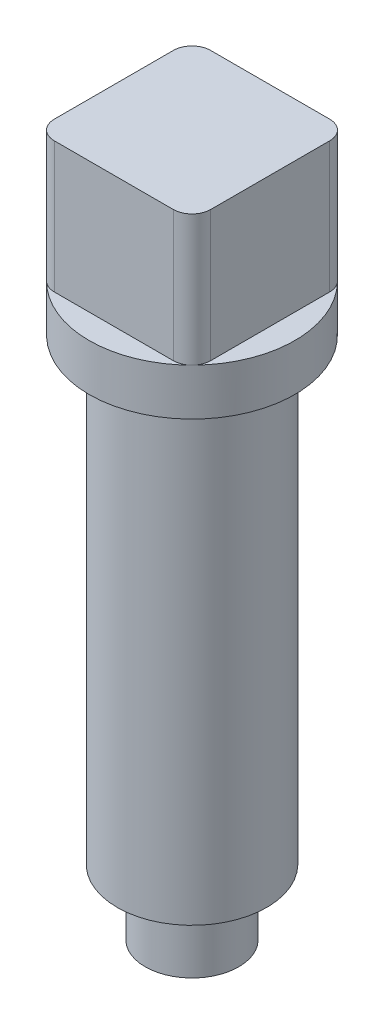
ISO-10303-21;
HEADER;
FILE_DESCRIPTION(('STEP AP214'),'2;1');
FILE_NAME('part.step','',(''),(''),'','','');
FILE_SCHEMA(('AUTOMOTIVE_DESIGN { 1 0 10303 214 1 1 1 1 }'));
ENDSEC;
DATA;
#1=APPLICATION_CONTEXT('core data for automotive mechanical design processes');
#2=APPLICATION_PROTOCOL_DEFINITION('international standard','automotive_design',2000,#1);
#3=PRODUCT_CONTEXT('',#1,'mechanical');
#4=PRODUCT('Part','Part','',(#3));
#5=PRODUCT_RELATED_PRODUCT_CATEGORY('part','',(#4));
#6=PRODUCT_DEFINITION_FORMATION('','',#4);
#7=PRODUCT_DEFINITION_CONTEXT('part definition',#1,'design');
#8=PRODUCT_DEFINITION('design','',#6,#7);
#9=PRODUCT_DEFINITION_SHAPE('','',#8);
#10=(LENGTH_UNIT() NAMED_UNIT(*) SI_UNIT(.MILLI.,.METRE.));
#11=(NAMED_UNIT(*) PLANE_ANGLE_UNIT() SI_UNIT($,.RADIAN.));
#12=(NAMED_UNIT(*) SI_UNIT($,.STERADIAN.) SOLID_ANGLE_UNIT());
#13=UNCERTAINTY_MEASURE_WITH_UNIT(LENGTH_MEASURE(1.E-05),#10,'distance_accuracy_value','');
#14=(GEOMETRIC_REPRESENTATION_CONTEXT(3) GLOBAL_UNCERTAINTY_ASSIGNED_CONTEXT((#13)) GLOBAL_UNIT_ASSIGNED_CONTEXT((#10,
#11,#12)) REPRESENTATION_CONTEXT('',''));
#15=CARTESIAN_POINT('',(0.,0.,0.));
#16=DIRECTION('',(0.,0.,1.));
#17=DIRECTION('',(1.,0.,0.));
#18=AXIS2_PLACEMENT_3D('',#15,#16,#17);
#19=CARTESIAN_POINT('',(11.,61.,0.));
#20=DIRECTION('',(0.,-1.,0.));
#21=DIRECTION('',(0.,0.,-1.));
#22=AXIS2_PLACEMENT_3D('',#19,#20,#21);
#23=PLANE('',#22);
#24=CARTESIAN_POINT('',(6.36396103067893,61.,-6.36396103067893));
#25=DIRECTION('',(0.,1.,0.));
#26=DIRECTION('',(0.,0.,1.));
#27=AXIS2_PLACEMENT_3D('',#24,#25,#26);
#28=CIRCLE('',#27,2.);
#29=CARTESIAN_POINT('',(8.36396103067893,61.,-6.36396103067893));
#30=VERTEX_POINT('',#29);
#31=CARTESIAN_POINT('',(7.77817459305202,61.,-7.77817459305202));
#32=VERTEX_POINT('',#31);
#33=EDGE_CURVE('E51',#30,#32,#28,.T.);
#34=ORIENTED_EDGE('',*,*,#33,.F.);
#35=DIRECTION('',(0.,0.,-1.));
#36=VECTOR('',#35,1.);
#37=CARTESIAN_POINT('',(8.36396103067893,61.,-6.36396103067893));
#38=LINE('',#37,#36);
#39=CARTESIAN_POINT('',(8.36396103067893,61.,6.36396103067893));
#40=VERTEX_POINT('',#39);
#41=EDGE_CURVE('E61',#40,#30,#38,.T.);
#42=ORIENTED_EDGE('',*,*,#41,.F.);
#43=CARTESIAN_POINT('',(6.36396103067893,61.,6.36396103067893));
#44=DIRECTION('',(0.,1.,0.));
#45=DIRECTION('',(0.,0.,1.));
#46=AXIS2_PLACEMENT_3D('',#43,#44,#45);
#47=CIRCLE('',#46,2.);
#48=CARTESIAN_POINT('',(7.77817459305202,61.,7.77817459305202));
#49=VERTEX_POINT('',#48);
#50=EDGE_CURVE('E49',#49,#40,#47,.T.);
#51=ORIENTED_EDGE('',*,*,#50,.F.);
#52=CARTESIAN_POINT('',(0.,61.,0.));
#53=DIRECTION('',(0.,1.,0.));
#54=DIRECTION('',(0.,0.,1.));
#55=AXIS2_PLACEMENT_3D('',#52,#53,#54);
#56=CIRCLE('',#55,11.);
#57=EDGE_CURVE('E149',#49,#32,#56,.T.);
#58=ORIENTED_EDGE('',*,*,#57,.T.);
#59=EDGE_LOOP('',(#34,#42,#51,#58));
#60=FACE_BOUND('',#59,.T.);
#61=ADVANCED_FACE('F40',(#60),#23,.F.);
#62=CARTESIAN_POINT('',(6.36396103067893,61.,-8.36396103067893));
#63=VERTEX_POINT('',#62);
#64=EDGE_CURVE('E11',#32,#63,#28,.T.);
#65=ORIENTED_EDGE('',*,*,#64,.F.);
#66=CARTESIAN_POINT('',(-7.77817459305202,61.,-7.77817459305202));
#67=VERTEX_POINT('',#66);
#68=EDGE_CURVE('E155',#32,#67,#56,.T.);
#69=ORIENTED_EDGE('',*,*,#68,.T.);
#70=CARTESIAN_POINT('',(-6.36396103067893,61.,-6.36396103067893));
#71=DIRECTION('',(0.,1.,0.));
#72=DIRECTION('',(0.,0.,1.));
#73=AXIS2_PLACEMENT_3D('',#70,#71,#72);
#74=CIRCLE('',#73,2.);
#75=CARTESIAN_POINT('',(-6.36396103067893,61.,-8.36396103067893));
#76=VERTEX_POINT('',#75);
#77=EDGE_CURVE('E172',#76,#67,#74,.T.);
#78=ORIENTED_EDGE('',*,*,#77,.F.);
#79=DIRECTION('',(-1.,0.,0.));
#80=VECTOR('',#79,1.);
#81=CARTESIAN_POINT('',(-6.36396103067893,61.,-8.36396103067893));
#82=LINE('',#81,#80);
#83=EDGE_CURVE('E138',#63,#76,#82,.T.);
#84=ORIENTED_EDGE('',*,*,#83,.F.);
#85=EDGE_LOOP('',(#65,#69,#78,#84));
#86=FACE_BOUND('',#85,.T.);
#87=ADVANCED_FACE('F226',(#86),#23,.F.);
#88=CARTESIAN_POINT('',(6.36396103067893,61.,8.36396103067893));
#89=VERTEX_POINT('',#88);
#90=EDGE_CURVE('E184',#89,#49,#47,.T.);
#91=ORIENTED_EDGE('',*,*,#90,.F.);
#92=DIRECTION('',(1.,0.,0.));
#93=VECTOR('',#92,1.);
#94=CARTESIAN_POINT('',(-6.36396103067893,61.,8.36396103067893));
#95=LINE('',#94,#93);
#96=CARTESIAN_POINT('',(-6.36396103067893,61.,8.36396103067893));
#97=VERTEX_POINT('',#96);
#98=EDGE_CURVE('E180',#97,#89,#95,.T.);
#99=ORIENTED_EDGE('',*,*,#98,.F.);
#100=CARTESIAN_POINT('',(-6.36396103067893,61.,6.36396103067893));
#101=DIRECTION('',(0.,1.,0.));
#102=DIRECTION('',(0.,0.,1.));
#103=AXIS2_PLACEMENT_3D('',#100,#101,#102);
#104=CIRCLE('',#103,2.);
#105=CARTESIAN_POINT('',(-7.77817459305202,61.,7.77817459305202));
#106=VERTEX_POINT('',#105);
#107=EDGE_CURVE('E170',#106,#97,#104,.T.);
#108=ORIENTED_EDGE('',*,*,#107,.F.);
#109=EDGE_CURVE('E144',#106,#49,#56,.T.);
#110=ORIENTED_EDGE('',*,*,#109,.T.);
#111=EDGE_LOOP('',(#91,#99,#108,#110));
#112=FACE_BOUND('',#111,.T.);
#113=ADVANCED_FACE('F214',(#112),#23,.F.);
#114=CARTESIAN_POINT('',(-8.36396103067893,61.,-6.36396103067893));
#115=VERTEX_POINT('',#114);
#116=EDGE_CURVE('E143',#67,#115,#74,.T.);
#117=ORIENTED_EDGE('',*,*,#116,.F.);
#118=EDGE_CURVE('E147',#67,#106,#56,.T.);
#119=ORIENTED_EDGE('',*,*,#118,.T.);
#120=CARTESIAN_POINT('',(-8.36396103067893,61.,6.36396103067893));
#121=VERTEX_POINT('',#120);
#122=EDGE_CURVE('E175',#121,#106,#104,.T.);
#123=ORIENTED_EDGE('',*,*,#122,.F.);
#124=DIRECTION('',(0.,0.,1.));
#125=VECTOR('',#124,1.);
#126=CARTESIAN_POINT('',(-8.36396103067893,61.,-6.36396103067893));
#127=LINE('',#126,#125);
#128=EDGE_CURVE('E178',#115,#121,#127,.T.);
#129=ORIENTED_EDGE('',*,*,#128,.F.);
#130=EDGE_LOOP('',(#117,#119,#123,#129));
#131=FACE_BOUND('',#130,.T.);
#132=ADVANCED_FACE('F224',(#131),#23,.F.);
#133=CARTESIAN_POINT('',(0.,0.,0.));
#134=DIRECTION('',(0.,1.,0.));
#135=DIRECTION('',(0.,0.,1.));
#136=AXIS2_PLACEMENT_3D('',#133,#134,#135);
#137=PLANE('',#136);
#138=CARTESIAN_POINT('',(0.,0.,0.));
#139=DIRECTION('',(0.,1.,0.));
#140=DIRECTION('',(0.,0.,1.));
#141=AXIS2_PLACEMENT_3D('',#138,#139,#140);
#142=CIRCLE('',#141,5.00000000000001);
#143=CARTESIAN_POINT('',(0.,0.,5.00000000000001));
#144=VERTEX_POINT('',#143);
#145=EDGE_CURVE('E44',#144,#144,#142,.T.);
#146=ORIENTED_EDGE('',*,*,#145,.F.);
#147=EDGE_LOOP('',(#146));
#148=FACE_BOUND('',#147,.T.);
#149=ADVANCED_FACE('F42',(#148),#137,.F.);
#150=CARTESIAN_POINT('',(0.,61.,0.));
#151=DIRECTION('',(0.,1.,0.));
#152=DIRECTION('',(0.,0.,1.));
#153=AXIS2_PLACEMENT_3D('',#150,#151,#152);
#154=CYLINDRICAL_SURFACE('',#153,5.00000000000001);
#155=CARTESIAN_POINT('',(0.,7.,0.));
#156=DIRECTION('',(0.,1.,0.));
#157=DIRECTION('',(0.,0.,1.));
#158=AXIS2_PLACEMENT_3D('',#155,#156,#157);
#159=CIRCLE('',#158,5.00000000000001);
#160=CARTESIAN_POINT('',(0.,7.,5.00000000000001));
#161=VERTEX_POINT('',#160);
#162=EDGE_CURVE('E163',#161,#161,#159,.T.);
#163=ORIENTED_EDGE('',*,*,#162,.F.);
#164=EDGE_LOOP('',(#163));
#165=FACE_BOUND('',#164,.T.);
#166=ORIENTED_EDGE('',*,*,#145,.T.);
#167=EDGE_LOOP('',(#166));
#168=FACE_BOUND('',#167,.T.);
#169=ADVANCED_FACE('F269',(#165,#168),#154,.T.);
#170=CARTESIAN_POINT('',(5.00000000000001,7.,0.));
#171=DIRECTION('',(0.,1.,0.));
#172=DIRECTION('',(0.,0.,1.));
#173=AXIS2_PLACEMENT_3D('',#170,#171,#172);
#174=PLANE('',#173);
#175=CARTESIAN_POINT('',(0.,7.,0.));
#176=DIRECTION('',(0.,1.,0.));
#177=DIRECTION('',(0.,0.,1.));
#178=AXIS2_PLACEMENT_3D('',#175,#176,#177);
#179=CIRCLE('',#178,8.00000000000001);
#180=CARTESIAN_POINT('',(0.,7.,8.00000000000001));
#181=VERTEX_POINT('',#180);
#182=EDGE_CURVE('E161',#181,#181,#179,.T.);
#183=ORIENTED_EDGE('',*,*,#182,.F.);
#184=EDGE_LOOP('',(#183));
#185=FACE_BOUND('',#184,.T.);
#186=ORIENTED_EDGE('',*,*,#162,.T.);
#187=EDGE_LOOP('',(#186));
#188=FACE_BOUND('',#187,.T.);
#189=ADVANCED_FACE('F305',(#185,#188),#174,.F.);
#190=CARTESIAN_POINT('',(0.,61.,0.));
#191=DIRECTION('',(0.,1.,0.));
#192=DIRECTION('',(0.,0.,1.));
#193=AXIS2_PLACEMENT_3D('',#190,#191,#192);
#194=CYLINDRICAL_SURFACE('',#193,8.00000000000001);
#195=CARTESIAN_POINT('',(0.,56.,0.));
#196=DIRECTION('',(0.,1.,0.));
#197=DIRECTION('',(0.,0.,1.));
#198=AXIS2_PLACEMENT_3D('',#195,#196,#197);
#199=CIRCLE('',#198,8.00000000000001);
#200=CARTESIAN_POINT('',(0.,56.,8.00000000000001));
#201=VERTEX_POINT('',#200);
#202=EDGE_CURVE('E158',#201,#201,#199,.T.);
#203=ORIENTED_EDGE('',*,*,#202,.F.);
#204=EDGE_LOOP('',(#203));
#205=FACE_BOUND('',#204,.T.);
#206=ORIENTED_EDGE('',*,*,#182,.T.);
#207=EDGE_LOOP('',(#206));
#208=FACE_BOUND('',#207,.T.);
#209=ADVANCED_FACE('F292',(#205,#208),#194,.T.);
#210=CARTESIAN_POINT('',(8.00000000000001,56.,0.));
#211=DIRECTION('',(0.,1.,0.));
#212=DIRECTION('',(0.,0.,1.));
#213=AXIS2_PLACEMENT_3D('',#210,#211,#212);
#214=PLANE('',#213);
#215=CARTESIAN_POINT('',(0.,56.,0.));
#216=DIRECTION('',(0.,1.,0.));
#217=DIRECTION('',(0.,0.,1.));
#218=AXIS2_PLACEMENT_3D('',#215,#216,#217);
#219=CIRCLE('',#218,11.);
#220=CARTESIAN_POINT('',(0.,56.,11.));
#221=VERTEX_POINT('',#220);
#222=EDGE_CURVE('E154',#221,#221,#219,.T.);
#223=ORIENTED_EDGE('',*,*,#222,.F.);
#224=EDGE_LOOP('',(#223));
#225=FACE_BOUND('',#224,.T.);
#226=ORIENTED_EDGE('',*,*,#202,.T.);
#227=EDGE_LOOP('',(#226));
#228=FACE_BOUND('',#227,.T.);
#229=ADVANCED_FACE('F287',(#225,#228),#214,.F.);
#230=CARTESIAN_POINT('',(0.,61.,0.));
#231=DIRECTION('',(0.,1.,0.));
#232=DIRECTION('',(0.,0.,1.));
#233=AXIS2_PLACEMENT_3D('',#230,#231,#232);
#234=CYLINDRICAL_SURFACE('',#233,11.);
#235=ORIENTED_EDGE('',*,*,#57,.F.);
#236=ORIENTED_EDGE('',*,*,#109,.F.);
#237=ORIENTED_EDGE('',*,*,#118,.F.);
#238=ORIENTED_EDGE('',*,*,#68,.F.);
#239=EDGE_LOOP('',(#235,#236,#237,#238));
#240=FACE_BOUND('',#239,.T.);
#241=ORIENTED_EDGE('',*,*,#222,.T.);
#242=EDGE_LOOP('',(#241));
#243=FACE_BOUND('',#242,.T.);
#244=ADVANCED_FACE('F219',(#240,#243),#234,.T.);
#245=CARTESIAN_POINT('',(-6.36396103067893,75.,-6.36396103067893));
#246=DIRECTION('',(0.,-1.,0.));
#247=DIRECTION('',(0.,0.,-1.));
#248=AXIS2_PLACEMENT_3D('',#245,#246,#247);
#249=CYLINDRICAL_SURFACE('',#248,2.);
#250=ORIENTED_EDGE('',*,*,#77,.T.);
#251=ORIENTED_EDGE('',*,*,#116,.T.);
#252=DIRECTION('',(0.,-1.,0.));
#253=VECTOR('',#252,1.);
#254=CARTESIAN_POINT('',(-8.36396103067893,75.,-6.36396103067893));
#255=LINE('',#254,#253);
#256=CARTESIAN_POINT('',(-8.36396103067893,75.,-6.36396103067893));
#257=VERTEX_POINT('',#256);
#258=EDGE_CURVE('E123',#257,#115,#255,.T.);
#259=ORIENTED_EDGE('',*,*,#258,.F.);
#260=CARTESIAN_POINT('',(-6.36396103067893,75.,-6.36396103067893));
#261=DIRECTION('',(0.,1.,0.));
#262=DIRECTION('',(0.,0.,1.));
#263=AXIS2_PLACEMENT_3D('',#260,#261,#262);
#264=CIRCLE('',#263,2.);
#265=CARTESIAN_POINT('',(-6.36396103067893,75.,-8.36396103067893));
#266=VERTEX_POINT('',#265);
#267=EDGE_CURVE('E129',#266,#257,#264,.T.);
#268=ORIENTED_EDGE('',*,*,#267,.F.);
#269=DIRECTION('',(0.,-1.,0.));
#270=VECTOR('',#269,1.);
#271=CARTESIAN_POINT('',(-6.36396103067893,75.,-8.36396103067893));
#272=LINE('',#271,#270);
#273=EDGE_CURVE('E190',#266,#76,#272,.T.);
#274=ORIENTED_EDGE('',*,*,#273,.T.);
#275=EDGE_LOOP('',(#250,#251,#259,#268,#274));
#276=FACE_BOUND('',#275,.T.);
#277=ADVANCED_FACE('F142',(#276),#249,.T.);
#278=CARTESIAN_POINT('',(-8.36396103067893,75.,-6.36396103067893));
#279=DIRECTION('',(1.,0.,0.));
#280=DIRECTION('',(0.,0.,-1.));
#281=AXIS2_PLACEMENT_3D('',#278,#279,#280);
#282=PLANE('',#281);
#283=ORIENTED_EDGE('',*,*,#128,.T.);
#284=DIRECTION('',(0.,-1.,0.));
#285=VECTOR('',#284,1.);
#286=CARTESIAN_POINT('',(-8.36396103067893,75.,6.36396103067893));
#287=LINE('',#286,#285);
#288=CARTESIAN_POINT('',(-8.36396103067893,75.,6.36396103067893));
#289=VERTEX_POINT('',#288);
#290=EDGE_CURVE('E125',#289,#121,#287,.T.);
#291=ORIENTED_EDGE('',*,*,#290,.F.);
#292=DIRECTION('',(0.,0.,1.));
#293=VECTOR('',#292,1.);
#294=CARTESIAN_POINT('',(-8.36396103067893,75.,-6.36396103067893));
#295=LINE('',#294,#293);
#296=EDGE_CURVE('E118',#257,#289,#295,.T.);
#297=ORIENTED_EDGE('',*,*,#296,.F.);
#298=ORIENTED_EDGE('',*,*,#258,.T.);
#299=EDGE_LOOP('',(#283,#291,#297,#298));
#300=FACE_BOUND('',#299,.T.);
#301=ADVANCED_FACE('F121',(#300),#282,.F.);
#302=CARTESIAN_POINT('',(-6.36396103067893,75.,6.36396103067893));
#303=DIRECTION('',(0.,-1.,0.));
#304=DIRECTION('',(0.,0.,-1.));
#305=AXIS2_PLACEMENT_3D('',#302,#303,#304);
#306=CYLINDRICAL_SURFACE('',#305,2.);
#307=ORIENTED_EDGE('',*,*,#122,.T.);
#308=ORIENTED_EDGE('',*,*,#107,.T.);
#309=DIRECTION('',(0.,-1.,0.));
#310=VECTOR('',#309,1.);
#311=CARTESIAN_POINT('',(-6.36396103067893,75.,8.36396103067893));
#312=LINE('',#311,#310);
#313=CARTESIAN_POINT('',(-6.36396103067893,75.,8.36396103067893));
#314=VERTEX_POINT('',#313);
#315=EDGE_CURVE('E150',#314,#97,#312,.T.);
#316=ORIENTED_EDGE('',*,*,#315,.F.);
#317=CARTESIAN_POINT('',(-6.36396103067893,75.,6.36396103067893));
#318=DIRECTION('',(0.,1.,0.));
#319=DIRECTION('',(0.,0.,1.));
#320=AXIS2_PLACEMENT_3D('',#317,#318,#319);
#321=CIRCLE('',#320,2.);
#322=EDGE_CURVE('E128',#289,#314,#321,.T.);
#323=ORIENTED_EDGE('',*,*,#322,.F.);
#324=ORIENTED_EDGE('',*,*,#290,.T.);
#325=EDGE_LOOP('',(#307,#308,#316,#323,#324));
#326=FACE_BOUND('',#325,.T.);
#327=ADVANCED_FACE('F211',(#326),#306,.T.);
#328=CARTESIAN_POINT('',(-6.36396103067893,75.,8.36396103067893));
#329=DIRECTION('',(0.,0.,-1.));
#330=DIRECTION('',(-1.,0.,0.));
#331=AXIS2_PLACEMENT_3D('',#328,#329,#330);
#332=PLANE('',#331);
#333=ORIENTED_EDGE('',*,*,#98,.T.);
#334=DIRECTION('',(0.,-1.,0.));
#335=VECTOR('',#334,1.);
#336=CARTESIAN_POINT('',(6.36396103067893,75.,8.36396103067893));
#337=LINE('',#336,#335);
#338=CARTESIAN_POINT('',(6.36396103067893,75.,8.36396103067893));
#339=VERTEX_POINT('',#338);
#340=EDGE_CURVE('E201',#339,#89,#337,.T.);
#341=ORIENTED_EDGE('',*,*,#340,.F.);
#342=DIRECTION('',(1.,0.,0.));
#343=VECTOR('',#342,1.);
#344=CARTESIAN_POINT('',(-6.36396103067893,75.,8.36396103067893));
#345=LINE('',#344,#343);
#346=EDGE_CURVE('E209',#314,#339,#345,.T.);
#347=ORIENTED_EDGE('',*,*,#346,.F.);
#348=ORIENTED_EDGE('',*,*,#315,.T.);
#349=EDGE_LOOP('',(#333,#341,#347,#348));
#350=FACE_BOUND('',#349,.T.);
#351=ADVANCED_FACE('F207',(#350),#332,.F.);
#352=CARTESIAN_POINT('',(6.36396103067893,75.,6.36396103067893));
#353=DIRECTION('',(0.,-1.,0.));
#354=DIRECTION('',(0.,0.,-1.));
#355=AXIS2_PLACEMENT_3D('',#352,#353,#354);
#356=CYLINDRICAL_SURFACE('',#355,2.);
#357=ORIENTED_EDGE('',*,*,#90,.T.);
#358=ORIENTED_EDGE('',*,*,#50,.T.);
#359=DIRECTION('',(0.,-1.,0.));
#360=VECTOR('',#359,1.);
#361=CARTESIAN_POINT('',(8.36396103067893,75.,6.36396103067893));
#362=LINE('',#361,#360);
#363=CARTESIAN_POINT('',(8.36396103067893,75.,6.36396103067893));
#364=VERTEX_POINT('',#363);
#365=EDGE_CURVE('E198',#364,#40,#362,.T.);
#366=ORIENTED_EDGE('',*,*,#365,.F.);
#367=CARTESIAN_POINT('',(6.36396103067893,75.,6.36396103067893));
#368=DIRECTION('',(0.,1.,0.));
#369=DIRECTION('',(0.,0.,1.));
#370=AXIS2_PLACEMENT_3D('',#367,#368,#369);
#371=CIRCLE('',#370,2.);
#372=EDGE_CURVE('E241',#339,#364,#371,.T.);
#373=ORIENTED_EDGE('',*,*,#372,.F.);
#374=ORIENTED_EDGE('',*,*,#340,.T.);
#375=EDGE_LOOP('',(#357,#358,#366,#373,#374));
#376=FACE_BOUND('',#375,.T.);
#377=ADVANCED_FACE('F240',(#376),#356,.T.);
#378=CARTESIAN_POINT('',(8.36396103067893,75.,-6.36396103067893));
#379=DIRECTION('',(-1.,0.,0.));
#380=DIRECTION('',(0.,0.,1.));
#381=AXIS2_PLACEMENT_3D('',#378,#379,#380);
#382=PLANE('',#381);
#383=ORIENTED_EDGE('',*,*,#41,.T.);
#384=DIRECTION('',(0.,-1.,0.));
#385=VECTOR('',#384,1.);
#386=CARTESIAN_POINT('',(8.36396103067893,75.,-6.36396103067893));
#387=LINE('',#386,#385);
#388=CARTESIAN_POINT('',(8.36396103067893,75.,-6.36396103067893));
#389=VERTEX_POINT('',#388);
#390=EDGE_CURVE('E195',#389,#30,#387,.T.);
#391=ORIENTED_EDGE('',*,*,#390,.F.);
#392=DIRECTION('',(0.,0.,-1.));
#393=VECTOR('',#392,1.);
#394=CARTESIAN_POINT('',(8.36396103067893,75.,-6.36396103067893));
#395=LINE('',#394,#393);
#396=EDGE_CURVE('E236',#364,#389,#395,.T.);
#397=ORIENTED_EDGE('',*,*,#396,.F.);
#398=ORIENTED_EDGE('',*,*,#365,.T.);
#399=EDGE_LOOP('',(#383,#391,#397,#398));
#400=FACE_BOUND('',#399,.T.);
#401=ADVANCED_FACE('F235',(#400),#382,.F.);
#402=CARTESIAN_POINT('',(6.36396103067893,75.,-6.36396103067893));
#403=DIRECTION('',(0.,-1.,0.));
#404=DIRECTION('',(0.,0.,-1.));
#405=AXIS2_PLACEMENT_3D('',#402,#403,#404);
#406=CYLINDRICAL_SURFACE('',#405,2.);
#407=ORIENTED_EDGE('',*,*,#33,.T.);
#408=ORIENTED_EDGE('',*,*,#64,.T.);
#409=DIRECTION('',(0.,-1.,0.));
#410=VECTOR('',#409,1.);
#411=CARTESIAN_POINT('',(6.36396103067893,75.,-8.36396103067893));
#412=LINE('',#411,#410);
#413=CARTESIAN_POINT('',(6.36396103067893,75.,-8.36396103067893));
#414=VERTEX_POINT('',#413);
#415=EDGE_CURVE('E192',#414,#63,#412,.T.);
#416=ORIENTED_EDGE('',*,*,#415,.F.);
#417=CARTESIAN_POINT('',(6.36396103067893,75.,-6.36396103067893));
#418=DIRECTION('',(0.,1.,0.));
#419=DIRECTION('',(0.,0.,1.));
#420=AXIS2_PLACEMENT_3D('',#417,#418,#419);
#421=CIRCLE('',#420,2.);
#422=EDGE_CURVE('E232',#389,#414,#421,.T.);
#423=ORIENTED_EDGE('',*,*,#422,.F.);
#424=ORIENTED_EDGE('',*,*,#390,.T.);
#425=EDGE_LOOP('',(#407,#408,#416,#423,#424));
#426=FACE_BOUND('',#425,.T.);
#427=ADVANCED_FACE('F228',(#426),#406,.T.);
#428=CARTESIAN_POINT('',(-6.36396103067893,75.,-8.36396103067893));
#429=DIRECTION('',(0.,0.,1.));
#430=DIRECTION('',(1.,0.,0.));
#431=AXIS2_PLACEMENT_3D('',#428,#429,#430);
#432=PLANE('',#431);
#433=ORIENTED_EDGE('',*,*,#83,.T.);
#434=ORIENTED_EDGE('',*,*,#273,.F.);
#435=DIRECTION('',(-1.,0.,0.));
#436=VECTOR('',#435,1.);
#437=CARTESIAN_POINT('',(-6.36396103067893,75.,-8.36396103067893));
#438=LINE('',#437,#436);
#439=EDGE_CURVE('E134',#414,#266,#438,.T.);
#440=ORIENTED_EDGE('',*,*,#439,.F.);
#441=ORIENTED_EDGE('',*,*,#415,.T.);
#442=EDGE_LOOP('',(#433,#434,#440,#441));
#443=FACE_BOUND('',#442,.T.);
#444=ADVANCED_FACE('F248',(#443),#432,.F.);
#445=CARTESIAN_POINT('',(-6.36396103067893,75.,-6.36396103067893));
#446=DIRECTION('',(0.,1.,0.));
#447=DIRECTION('',(0.,0.,1.));
#448=AXIS2_PLACEMENT_3D('',#445,#446,#447);
#449=PLANE('',#448);
#450=ORIENTED_EDGE('',*,*,#267,.T.);
#451=ORIENTED_EDGE('',*,*,#296,.T.);
#452=ORIENTED_EDGE('',*,*,#322,.T.);
#453=ORIENTED_EDGE('',*,*,#346,.T.);
#454=ORIENTED_EDGE('',*,*,#372,.T.);
#455=ORIENTED_EDGE('',*,*,#396,.T.);
#456=ORIENTED_EDGE('',*,*,#422,.T.);
#457=ORIENTED_EDGE('',*,*,#439,.T.);
#458=EDGE_LOOP('',(#450,#451,#452,#453,#454,#455,#456,#457));
#459=FACE_BOUND('',#458,.T.);
#460=ADVANCED_FACE('F132',(#459),#449,.T.);
#461=CLOSED_SHELL('',(#61,#87,#113,#132,#149,#169,#189,#209,#229,#244,#277,#301,#327,#351,#377,
#401,#427,#444,#460));
#462=MANIFOLD_SOLID_BREP('B2',#461);
#463=ADVANCED_BREP_SHAPE_REPRESENTATION('',(#18,#462),#14);
#464=SHAPE_DEFINITION_REPRESENTATION(#9,#463);
ENDSEC;
END-ISO-10303-21;
